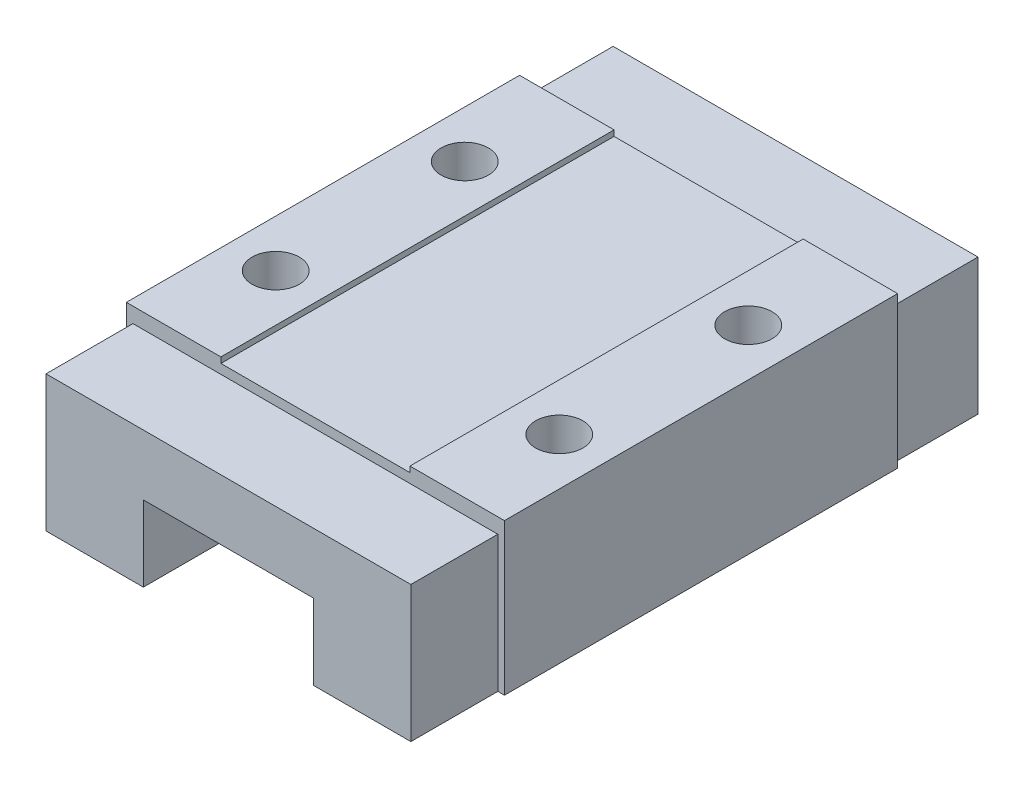
ISO-10303-21;
HEADER;
FILE_DESCRIPTION(('STEP AP214'),'2;1');
FILE_NAME('part.step','',(''),(''),'','','');
FILE_SCHEMA(('AUTOMOTIVE_DESIGN { 1 0 10303 214 1 1 1 1 }'));
ENDSEC;
DATA;
#1=APPLICATION_CONTEXT('core data for automotive mechanical design processes');
#2=APPLICATION_PROTOCOL_DEFINITION('international standard','automotive_design',2000,#1);
#3=PRODUCT_CONTEXT('',#1,'mechanical');
#4=PRODUCT('Part','Part','',(#3));
#5=PRODUCT_RELATED_PRODUCT_CATEGORY('part','',(#4));
#6=PRODUCT_DEFINITION_FORMATION('','',#4);
#7=PRODUCT_DEFINITION_CONTEXT('part definition',#1,'design');
#8=PRODUCT_DEFINITION('design','',#6,#7);
#9=PRODUCT_DEFINITION_SHAPE('','',#8);
#10=(LENGTH_UNIT() NAMED_UNIT(*) SI_UNIT(.MILLI.,.METRE.));
#11=(NAMED_UNIT(*) PLANE_ANGLE_UNIT() SI_UNIT($,.RADIAN.));
#12=(NAMED_UNIT(*) SI_UNIT($,.STERADIAN.) SOLID_ANGLE_UNIT());
#13=UNCERTAINTY_MEASURE_WITH_UNIT(LENGTH_MEASURE(1.E-05),#10,'distance_accuracy_value','');
#14=(GEOMETRIC_REPRESENTATION_CONTEXT(3) GLOBAL_UNCERTAINTY_ASSIGNED_CONTEXT((#13)) GLOBAL_UNIT_ASSIGNED_CONTEXT((#10,
#11,#12)) REPRESENTATION_CONTEXT('',''));
#15=CARTESIAN_POINT('',(0.,0.,0.));
#16=DIRECTION('',(0.,0.,1.));
#17=DIRECTION('',(1.,0.,0.));
#18=AXIS2_PLACEMENT_3D('',#15,#16,#17);
#19=CARTESIAN_POINT('',(0.,0.,10.4));
#20=DIRECTION('',(0.,0.,-1.));
#21=DIRECTION('',(-1.,0.,0.));
#22=AXIS2_PLACEMENT_3D('',#19,#20,#21);
#23=PLANE('',#22);
#24=DIRECTION('',(0.,-1.,0.));
#25=VECTOR('',#24,1.);
#26=CARTESIAN_POINT('',(-9.65,0.,10.4));
#27=LINE('',#26,#25);
#28=CARTESIAN_POINT('',(-9.65,-0.8,10.4));
#29=VERTEX_POINT('',#28);
#30=CARTESIAN_POINT('',(-9.65,-8.,10.4));
#31=VERTEX_POINT('',#30);
#32=EDGE_CURVE('E275',#29,#31,#27,.T.);
#33=ORIENTED_EDGE('',*,*,#32,.F.);
#34=DIRECTION('',(-1.,0.,0.));
#35=VECTOR('',#34,1.);
#36=CARTESIAN_POINT('',(0.,-0.8,10.4));
#37=LINE('',#36,#35);
#38=CARTESIAN_POINT('',(9.65,-0.8,10.4));
#39=VERTEX_POINT('',#38);
#40=EDGE_CURVE('E49',#39,#29,#37,.T.);
#41=ORIENTED_EDGE('',*,*,#40,.F.);
#42=DIRECTION('',(0.,1.,0.));
#43=VECTOR('',#42,1.);
#44=CARTESIAN_POINT('',(9.65,0.,10.4));
#45=LINE('',#44,#43);
#46=CARTESIAN_POINT('',(9.65,-8.,10.4));
#47=VERTEX_POINT('',#46);
#48=EDGE_CURVE('E53',#47,#39,#45,.T.);
#49=ORIENTED_EDGE('',*,*,#48,.F.);
#50=DIRECTION('',(1.,0.,0.));
#51=VECTOR('',#50,1.);
#52=CARTESIAN_POINT('',(10.,-8.,10.4));
#53=LINE('',#52,#51);
#54=CARTESIAN_POINT('',(10.,-8.,10.4));
#55=VERTEX_POINT('',#54);
#56=EDGE_CURVE('E285',#47,#55,#53,.T.);
#57=ORIENTED_EDGE('',*,*,#56,.T.);
#58=DIRECTION('',(0.,1.,0.));
#59=VECTOR('',#58,1.);
#60=CARTESIAN_POINT('',(10.,0.,10.4));
#61=LINE('',#60,#59);
#62=CARTESIAN_POINT('',(10.,0.,10.4));
#63=VERTEX_POINT('',#62);
#64=EDGE_CURVE('E287',#55,#63,#61,.T.);
#65=ORIENTED_EDGE('',*,*,#64,.T.);
#66=DIRECTION('',(-1.,0.,0.));
#67=VECTOR('',#66,1.);
#68=CARTESIAN_POINT('',(5.,0.,10.4));
#69=LINE('',#68,#67);
#70=CARTESIAN_POINT('',(5.,0.,10.4));
#71=VERTEX_POINT('',#70);
#72=EDGE_CURVE('E289',#63,#71,#69,.T.);
#73=ORIENTED_EDGE('',*,*,#72,.T.);
#74=DIRECTION('',(0.,-1.,0.));
#75=VECTOR('',#74,1.);
#76=CARTESIAN_POINT('',(5.,-0.3,10.4));
#77=LINE('',#76,#75);
#78=CARTESIAN_POINT('',(5.,-0.3,10.4));
#79=VERTEX_POINT('',#78);
#80=EDGE_CURVE('E291',#71,#79,#77,.T.);
#81=ORIENTED_EDGE('',*,*,#80,.T.);
#82=DIRECTION('',(-1.,0.,0.));
#83=VECTOR('',#82,1.);
#84=CARTESIAN_POINT('',(-5.,-0.3,10.4));
#85=LINE('',#84,#83);
#86=CARTESIAN_POINT('',(-5.,-0.3,10.4));
#87=VERTEX_POINT('',#86);
#88=EDGE_CURVE('E293',#79,#87,#85,.T.);
#89=ORIENTED_EDGE('',*,*,#88,.T.);
#90=DIRECTION('',(0.,1.,0.));
#91=VECTOR('',#90,1.);
#92=CARTESIAN_POINT('',(-5.,0.,10.4));
#93=LINE('',#92,#91);
#94=CARTESIAN_POINT('',(-5.,0.,10.4));
#95=VERTEX_POINT('',#94);
#96=EDGE_CURVE('E295',#87,#95,#93,.T.);
#97=ORIENTED_EDGE('',*,*,#96,.T.);
#98=DIRECTION('',(-1.,0.,0.));
#99=VECTOR('',#98,1.);
#100=CARTESIAN_POINT('',(-10.,0.,10.4));
#101=LINE('',#100,#99);
#102=CARTESIAN_POINT('',(-10.,0.,10.4));
#103=VERTEX_POINT('',#102);
#104=EDGE_CURVE('E297',#95,#103,#101,.T.);
#105=ORIENTED_EDGE('',*,*,#104,.T.);
#106=DIRECTION('',(0.,-1.,0.));
#107=VECTOR('',#106,1.);
#108=CARTESIAN_POINT('',(-10.,-8.,10.4));
#109=LINE('',#108,#107);
#110=CARTESIAN_POINT('',(-10.,-8.,10.4));
#111=VERTEX_POINT('',#110);
#112=EDGE_CURVE('E279',#103,#111,#109,.T.);
#113=ORIENTED_EDGE('',*,*,#112,.T.);
#114=DIRECTION('',(1.,0.,0.));
#115=VECTOR('',#114,1.);
#116=CARTESIAN_POINT('',(-4.5,-8.,10.4));
#117=LINE('',#116,#115);
#118=EDGE_CURVE('E282',#111,#31,#117,.T.);
#119=ORIENTED_EDGE('',*,*,#118,.T.);
#120=EDGE_LOOP('',(#33,#41,#49,#57,#65,#73,#81,#89,#97,#105,#113,#119));
#121=FACE_BOUND('',#120,.T.);
#122=ADVANCED_FACE('F34',(#121),#23,.F.);
#123=CARTESIAN_POINT('',(0.,0.,-10.4));
#124=DIRECTION('',(0.,0.,-1.));
#125=DIRECTION('',(-1.,0.,0.));
#126=AXIS2_PLACEMENT_3D('',#123,#124,#125);
#127=PLANE('',#126);
#128=DIRECTION('',(-1.,0.,0.));
#129=VECTOR('',#128,1.);
#130=CARTESIAN_POINT('',(0.,-0.8,-10.4));
#131=LINE('',#130,#129);
#132=CARTESIAN_POINT('',(9.65,-0.8,-10.4));
#133=VERTEX_POINT('',#132);
#134=CARTESIAN_POINT('',(-9.65,-0.8,-10.4));
#135=VERTEX_POINT('',#134);
#136=EDGE_CURVE('E349',#133,#135,#131,.T.);
#137=ORIENTED_EDGE('',*,*,#136,.T.);
#138=DIRECTION('',(0.,-1.,0.));
#139=VECTOR('',#138,1.);
#140=CARTESIAN_POINT('',(-9.65,0.,-10.4));
#141=LINE('',#140,#139);
#142=CARTESIAN_POINT('',(-9.65,-8.,-10.4));
#143=VERTEX_POINT('',#142);
#144=EDGE_CURVE('E11',#135,#143,#141,.T.);
#145=ORIENTED_EDGE('',*,*,#144,.T.);
#146=DIRECTION('',(1.,0.,0.));
#147=VECTOR('',#146,1.);
#148=CARTESIAN_POINT('',(-4.5,-8.,-10.4));
#149=LINE('',#148,#147);
#150=CARTESIAN_POINT('',(-10.,-8.,-10.4));
#151=VERTEX_POINT('',#150);
#152=EDGE_CURVE('E302',#151,#143,#149,.T.);
#153=ORIENTED_EDGE('',*,*,#152,.F.);
#154=DIRECTION('',(0.,-1.,0.));
#155=VECTOR('',#154,1.);
#156=CARTESIAN_POINT('',(-10.,-8.,-10.4));
#157=LINE('',#156,#155);
#158=CARTESIAN_POINT('',(-10.,0.,-10.4));
#159=VERTEX_POINT('',#158);
#160=EDGE_CURVE('E278',#159,#151,#157,.T.);
#161=ORIENTED_EDGE('',*,*,#160,.F.);
#162=DIRECTION('',(-1.,0.,0.));
#163=VECTOR('',#162,1.);
#164=CARTESIAN_POINT('',(-10.,0.,-10.4));
#165=LINE('',#164,#163);
#166=CARTESIAN_POINT('',(-5.,0.,-10.4));
#167=VERTEX_POINT('',#166);
#168=EDGE_CURVE('E283',#167,#159,#165,.T.);
#169=ORIENTED_EDGE('',*,*,#168,.F.);
#170=DIRECTION('',(0.,1.,0.));
#171=VECTOR('',#170,1.);
#172=CARTESIAN_POINT('',(-5.,0.,-10.4));
#173=LINE('',#172,#171);
#174=CARTESIAN_POINT('',(-5.,-0.3,-10.4));
#175=VERTEX_POINT('',#174);
#176=EDGE_CURVE('E315',#175,#167,#173,.T.);
#177=ORIENTED_EDGE('',*,*,#176,.F.);
#178=DIRECTION('',(-1.,0.,0.));
#179=VECTOR('',#178,1.);
#180=CARTESIAN_POINT('',(-5.,-0.3,-10.4));
#181=LINE('',#180,#179);
#182=CARTESIAN_POINT('',(5.,-0.3,-10.4));
#183=VERTEX_POINT('',#182);
#184=EDGE_CURVE('E313',#183,#175,#181,.T.);
#185=ORIENTED_EDGE('',*,*,#184,.F.);
#186=DIRECTION('',(0.,-1.,0.));
#187=VECTOR('',#186,1.);
#188=CARTESIAN_POINT('',(5.,-0.3,-10.4));
#189=LINE('',#188,#187);
#190=CARTESIAN_POINT('',(5.,0.,-10.4));
#191=VERTEX_POINT('',#190);
#192=EDGE_CURVE('E311',#191,#183,#189,.T.);
#193=ORIENTED_EDGE('',*,*,#192,.F.);
#194=DIRECTION('',(-1.,0.,0.));
#195=VECTOR('',#194,1.);
#196=CARTESIAN_POINT('',(5.,0.,-10.4));
#197=LINE('',#196,#195);
#198=CARTESIAN_POINT('',(10.,0.,-10.4));
#199=VERTEX_POINT('',#198);
#200=EDGE_CURVE('E309',#199,#191,#197,.T.);
#201=ORIENTED_EDGE('',*,*,#200,.F.);
#202=DIRECTION('',(0.,1.,0.));
#203=VECTOR('',#202,1.);
#204=CARTESIAN_POINT('',(10.,0.,-10.4));
#205=LINE('',#204,#203);
#206=CARTESIAN_POINT('',(10.,-8.,-10.4));
#207=VERTEX_POINT('',#206);
#208=EDGE_CURVE('E307',#207,#199,#205,.T.);
#209=ORIENTED_EDGE('',*,*,#208,.F.);
#210=DIRECTION('',(1.,0.,0.));
#211=VECTOR('',#210,1.);
#212=CARTESIAN_POINT('',(10.,-8.,-10.4));
#213=LINE('',#212,#211);
#214=CARTESIAN_POINT('',(9.65,-8.,-10.4));
#215=VERTEX_POINT('',#214);
#216=EDGE_CURVE('E305',#215,#207,#213,.T.);
#217=ORIENTED_EDGE('',*,*,#216,.F.);
#218=DIRECTION('',(0.,1.,0.));
#219=VECTOR('',#218,1.);
#220=CARTESIAN_POINT('',(9.65,0.,-10.4));
#221=LINE('',#220,#219);
#222=EDGE_CURVE('E42',#215,#133,#221,.T.);
#223=ORIENTED_EDGE('',*,*,#222,.T.);
#224=EDGE_LOOP('',(#137,#145,#153,#161,#169,#177,#185,#193,#201,#209,#217,#223));
#225=FACE_BOUND('',#224,.T.);
#226=ADVANCED_FACE('F354',(#225),#127,.T.);
#227=CARTESIAN_POINT('',(-10.,-8.,10.4));
#228=DIRECTION('',(1.,0.,0.));
#229=DIRECTION('',(0.,1.,0.));
#230=AXIS2_PLACEMENT_3D('',#227,#228,#229);
#231=PLANE('',#230);
#232=ORIENTED_EDGE('',*,*,#160,.T.);
#233=DIRECTION('',(0.,0.,-1.));
#234=VECTOR('',#233,1.);
#235=CARTESIAN_POINT('',(-10.,-8.,10.4));
#236=LINE('',#235,#234);
#237=EDGE_CURVE('E346',#111,#151,#236,.T.);
#238=ORIENTED_EDGE('',*,*,#237,.F.);
#239=ORIENTED_EDGE('',*,*,#112,.F.);
#240=DIRECTION('',(0.,0.,-1.));
#241=VECTOR('',#240,1.);
#242=CARTESIAN_POINT('',(-10.,0.,10.4));
#243=LINE('',#242,#241);
#244=EDGE_CURVE('E299',#103,#159,#243,.T.);
#245=ORIENTED_EDGE('',*,*,#244,.T.);
#246=EDGE_LOOP('',(#232,#238,#239,#245));
#247=FACE_BOUND('',#246,.T.);
#248=ADVANCED_FACE('F36',(#247),#231,.F.);
#249=CARTESIAN_POINT('',(-4.5,-8.,10.4));
#250=DIRECTION('',(0.,1.,0.));
#251=DIRECTION('',(-1.,0.,0.));
#252=AXIS2_PLACEMENT_3D('',#249,#250,#251);
#253=PLANE('',#252);
#254=DIRECTION('',(0.,0.,-1.));
#255=VECTOR('',#254,1.);
#256=CARTESIAN_POINT('',(-4.5,-8.,10.4));
#257=LINE('',#256,#255);
#258=CARTESIAN_POINT('',(-4.5,-8.,15.));
#259=VERTEX_POINT('',#258);
#260=CARTESIAN_POINT('',(-4.5,-8.,-15.));
#261=VERTEX_POINT('',#260);
#262=EDGE_CURVE('E344',#259,#261,#257,.T.);
#263=ORIENTED_EDGE('',*,*,#262,.F.);
#264=DIRECTION('',(1.,0.,0.));
#265=VECTOR('',#264,1.);
#266=CARTESIAN_POINT('',(-4.5,-8.,15.));
#267=LINE('',#266,#265);
#268=CARTESIAN_POINT('',(-9.65,-8.,15.));
#269=VERTEX_POINT('',#268);
#270=EDGE_CURVE('E216',#269,#259,#267,.T.);
#271=ORIENTED_EDGE('',*,*,#270,.F.);
#272=DIRECTION('',(0.,0.,-1.));
#273=VECTOR('',#272,1.);
#274=CARTESIAN_POINT('',(-9.65,-8.,15.));
#275=LINE('',#274,#273);
#276=EDGE_CURVE('E270',#269,#31,#275,.T.);
#277=ORIENTED_EDGE('',*,*,#276,.T.);
#278=ORIENTED_EDGE('',*,*,#118,.F.);
#279=ORIENTED_EDGE('',*,*,#237,.T.);
#280=ORIENTED_EDGE('',*,*,#152,.T.);
#281=CARTESIAN_POINT('',(-9.65,-8.,-15.));
#282=VERTEX_POINT('',#281);
#283=EDGE_CURVE('E269',#143,#282,#275,.T.);
#284=ORIENTED_EDGE('',*,*,#283,.T.);
#285=DIRECTION('',(1.,0.,0.));
#286=VECTOR('',#285,1.);
#287=CARTESIAN_POINT('',(-4.5,-8.,-15.));
#288=LINE('',#287,#286);
#289=EDGE_CURVE('E238',#282,#261,#288,.T.);
#290=ORIENTED_EDGE('',*,*,#289,.T.);
#291=EDGE_LOOP('',(#263,#271,#277,#278,#279,#280,#284,#290));
#292=FACE_BOUND('',#291,.T.);
#293=ADVANCED_FACE('F379',(#292),#253,.F.);
#294=CARTESIAN_POINT('',(-4.5,-4.,10.4));
#295=DIRECTION('',(-1.,0.,0.));
#296=DIRECTION('',(0.,0.,1.));
#297=AXIS2_PLACEMENT_3D('',#294,#295,#296);
#298=PLANE('',#297);
#299=ORIENTED_EDGE('',*,*,#262,.T.);
#300=DIRECTION('',(0.,1.,0.));
#301=VECTOR('',#300,1.);
#302=CARTESIAN_POINT('',(-4.5,-4.,-15.));
#303=LINE('',#302,#301);
#304=CARTESIAN_POINT('',(-4.5,-4.,-15.));
#305=VERTEX_POINT('',#304);
#306=EDGE_CURVE('E241',#261,#305,#303,.T.);
#307=ORIENTED_EDGE('',*,*,#306,.T.);
#308=DIRECTION('',(0.,0.,-1.));
#309=VECTOR('',#308,1.);
#310=CARTESIAN_POINT('',(-4.5,-4.,10.4));
#311=LINE('',#310,#309);
#312=CARTESIAN_POINT('',(-4.5,-4.,15.));
#313=VERTEX_POINT('',#312);
#314=EDGE_CURVE('E342',#313,#305,#311,.T.);
#315=ORIENTED_EDGE('',*,*,#314,.F.);
#316=DIRECTION('',(0.,1.,0.));
#317=VECTOR('',#316,1.);
#318=CARTESIAN_POINT('',(-4.5,-4.,15.));
#319=LINE('',#318,#317);
#320=EDGE_CURVE('E220',#259,#313,#319,.T.);
#321=ORIENTED_EDGE('',*,*,#320,.F.);
#322=EDGE_LOOP('',(#299,#307,#315,#321));
#323=FACE_BOUND('',#322,.T.);
#324=ADVANCED_FACE('F431',(#323),#298,.F.);
#325=CARTESIAN_POINT('',(4.5,-4.,10.4));
#326=DIRECTION('',(0.,1.,0.));
#327=DIRECTION('',(-1.,0.,0.));
#328=AXIS2_PLACEMENT_3D('',#325,#326,#327);
#329=PLANE('',#328);
#330=ORIENTED_EDGE('',*,*,#314,.T.);
#331=DIRECTION('',(1.,0.,0.));
#332=VECTOR('',#331,1.);
#333=CARTESIAN_POINT('',(4.5,-4.,-15.));
#334=LINE('',#333,#332);
#335=CARTESIAN_POINT('',(4.5,-4.,-15.));
#336=VERTEX_POINT('',#335);
#337=EDGE_CURVE('E244',#305,#336,#334,.T.);
#338=ORIENTED_EDGE('',*,*,#337,.T.);
#339=DIRECTION('',(0.,0.,-1.));
#340=VECTOR('',#339,1.);
#341=CARTESIAN_POINT('',(4.5,-4.,10.4));
#342=LINE('',#341,#340);
#343=CARTESIAN_POINT('',(4.5,-4.,15.));
#344=VERTEX_POINT('',#343);
#345=EDGE_CURVE('E340',#344,#336,#342,.T.);
#346=ORIENTED_EDGE('',*,*,#345,.F.);
#347=DIRECTION('',(1.,0.,0.));
#348=VECTOR('',#347,1.);
#349=CARTESIAN_POINT('',(4.5,-4.,15.));
#350=LINE('',#349,#348);
#351=EDGE_CURVE('E223',#313,#344,#350,.T.);
#352=ORIENTED_EDGE('',*,*,#351,.F.);
#353=EDGE_LOOP('',(#330,#338,#346,#352));
#354=FACE_BOUND('',#353,.T.);
#355=ADVANCED_FACE('F428',(#354),#329,.F.);
#356=CARTESIAN_POINT('',(4.5,-8.,10.4));
#357=DIRECTION('',(1.,0.,0.));
#358=DIRECTION('',(0.,0.,-1.));
#359=AXIS2_PLACEMENT_3D('',#356,#357,#358);
#360=PLANE('',#359);
#361=ORIENTED_EDGE('',*,*,#345,.T.);
#362=DIRECTION('',(0.,-1.,0.));
#363=VECTOR('',#362,1.);
#364=CARTESIAN_POINT('',(4.5,-8.,-15.));
#365=LINE('',#364,#363);
#366=CARTESIAN_POINT('',(4.5,-8.,-15.));
#367=VERTEX_POINT('',#366);
#368=EDGE_CURVE('E247',#336,#367,#365,.T.);
#369=ORIENTED_EDGE('',*,*,#368,.T.);
#370=DIRECTION('',(0.,0.,-1.));
#371=VECTOR('',#370,1.);
#372=CARTESIAN_POINT('',(4.5,-8.,10.4));
#373=LINE('',#372,#371);
#374=CARTESIAN_POINT('',(4.5,-8.,15.));
#375=VERTEX_POINT('',#374);
#376=EDGE_CURVE('E338',#375,#367,#373,.T.);
#377=ORIENTED_EDGE('',*,*,#376,.F.);
#378=DIRECTION('',(0.,-1.,0.));
#379=VECTOR('',#378,1.);
#380=CARTESIAN_POINT('',(4.5,-8.,15.));
#381=LINE('',#380,#379);
#382=EDGE_CURVE('E226',#344,#375,#381,.T.);
#383=ORIENTED_EDGE('',*,*,#382,.F.);
#384=EDGE_LOOP('',(#361,#369,#377,#383));
#385=FACE_BOUND('',#384,.T.);
#386=ADVANCED_FACE('F424',(#385),#360,.F.);
#387=CARTESIAN_POINT('',(10.,-8.,10.4));
#388=DIRECTION('',(0.,1.,0.));
#389=DIRECTION('',(-1.,0.,0.));
#390=AXIS2_PLACEMENT_3D('',#387,#388,#389);
#391=PLANE('',#390);
#392=ORIENTED_EDGE('',*,*,#376,.T.);
#393=DIRECTION('',(1.,0.,0.));
#394=VECTOR('',#393,1.);
#395=CARTESIAN_POINT('',(9.65,-8.,-15.));
#396=LINE('',#395,#394);
#397=CARTESIAN_POINT('',(9.65,-8.,-15.));
#398=VERTEX_POINT('',#397);
#399=EDGE_CURVE('E250',#367,#398,#396,.T.);
#400=ORIENTED_EDGE('',*,*,#399,.T.);
#401=DIRECTION('',(0.,0.,-1.));
#402=VECTOR('',#401,1.);
#403=CARTESIAN_POINT('',(9.65,-8.,15.));
#404=LINE('',#403,#402);
#405=EDGE_CURVE('E265',#215,#398,#404,.T.);
#406=ORIENTED_EDGE('',*,*,#405,.F.);
#407=ORIENTED_EDGE('',*,*,#216,.T.);
#408=DIRECTION('',(0.,0.,-1.));
#409=VECTOR('',#408,1.);
#410=CARTESIAN_POINT('',(10.,-8.,10.4));
#411=LINE('',#410,#409);
#412=EDGE_CURVE('E335',#55,#207,#411,.T.);
#413=ORIENTED_EDGE('',*,*,#412,.F.);
#414=ORIENTED_EDGE('',*,*,#56,.F.);
#415=CARTESIAN_POINT('',(9.65,-8.,15.));
#416=VERTEX_POINT('',#415);
#417=EDGE_CURVE('E266',#416,#47,#404,.T.);
#418=ORIENTED_EDGE('',*,*,#417,.F.);
#419=DIRECTION('',(1.,0.,0.));
#420=VECTOR('',#419,1.);
#421=CARTESIAN_POINT('',(9.65,-8.,15.));
#422=LINE('',#421,#420);
#423=EDGE_CURVE('E229',#375,#416,#422,.T.);
#424=ORIENTED_EDGE('',*,*,#423,.F.);
#425=EDGE_LOOP('',(#392,#400,#406,#407,#413,#414,#418,#424));
#426=FACE_BOUND('',#425,.T.);
#427=ADVANCED_FACE('F361',(#426),#391,.F.);
#428=CARTESIAN_POINT('',(10.,0.,10.4));
#429=DIRECTION('',(-1.,0.,0.));
#430=DIRECTION('',(0.,-1.,0.));
#431=AXIS2_PLACEMENT_3D('',#428,#429,#430);
#432=PLANE('',#431);
#433=ORIENTED_EDGE('',*,*,#208,.T.);
#434=DIRECTION('',(0.,0.,-1.));
#435=VECTOR('',#434,1.);
#436=CARTESIAN_POINT('',(10.,0.,10.4));
#437=LINE('',#436,#435);
#438=EDGE_CURVE('E332',#63,#199,#437,.T.);
#439=ORIENTED_EDGE('',*,*,#438,.F.);
#440=ORIENTED_EDGE('',*,*,#64,.F.);
#441=ORIENTED_EDGE('',*,*,#412,.T.);
#442=EDGE_LOOP('',(#433,#439,#440,#441));
#443=FACE_BOUND('',#442,.T.);
#444=ADVANCED_FACE('F411',(#443),#432,.F.);
#445=CARTESIAN_POINT('',(5.,0.,10.4));
#446=DIRECTION('',(0.,-1.,0.));
#447=DIRECTION('',(0.,0.,-1.));
#448=AXIS2_PLACEMENT_3D('',#445,#446,#447);
#449=PLANE('',#448);
#450=CARTESIAN_POINT('',(7.5,0.,-5.));
#451=DIRECTION('',(0.,1.,0.));
#452=DIRECTION('',(0.,0.,1.));
#453=AXIS2_PLACEMENT_3D('',#450,#451,#452);
#454=CIRCLE('',#453,1.25);
#455=CARTESIAN_POINT('',(7.5,0.,-3.75));
#456=VERTEX_POINT('',#455);
#457=EDGE_CURVE('E190',#456,#456,#454,.T.);
#458=ORIENTED_EDGE('',*,*,#457,.F.);
#459=EDGE_LOOP('',(#458));
#460=FACE_BOUND('',#459,.T.);
#461=CARTESIAN_POINT('',(7.5,0.,5.));
#462=DIRECTION('',(0.,1.,0.));
#463=DIRECTION('',(0.,0.,1.));
#464=AXIS2_PLACEMENT_3D('',#461,#462,#463);
#465=CIRCLE('',#464,1.25);
#466=CARTESIAN_POINT('',(7.5,0.,6.25));
#467=VERTEX_POINT('',#466);
#468=EDGE_CURVE('E189',#467,#467,#465,.T.);
#469=ORIENTED_EDGE('',*,*,#468,.F.);
#470=EDGE_LOOP('',(#469));
#471=FACE_BOUND('',#470,.T.);
#472=ORIENTED_EDGE('',*,*,#200,.T.);
#473=DIRECTION('',(0.,0.,-1.));
#474=VECTOR('',#473,1.);
#475=CARTESIAN_POINT('',(5.,0.,10.4));
#476=LINE('',#475,#474);
#477=EDGE_CURVE('E329',#71,#191,#476,.T.);
#478=ORIENTED_EDGE('',*,*,#477,.F.);
#479=ORIENTED_EDGE('',*,*,#72,.F.);
#480=ORIENTED_EDGE('',*,*,#438,.T.);
#481=EDGE_LOOP('',(#472,#478,#479,#480));
#482=FACE_BOUND('',#481,.T.);
#483=ADVANCED_FACE('F407',(#460,#471,#482),#449,.F.);
#484=CARTESIAN_POINT('',(5.,-0.3,10.4));
#485=DIRECTION('',(1.,0.,0.));
#486=DIRECTION('',(0.,0.,-1.));
#487=AXIS2_PLACEMENT_3D('',#484,#485,#486);
#488=PLANE('',#487);
#489=ORIENTED_EDGE('',*,*,#192,.T.);
#490=DIRECTION('',(0.,0.,-1.));
#491=VECTOR('',#490,1.);
#492=CARTESIAN_POINT('',(5.,-0.3,10.4));
#493=LINE('',#492,#491);
#494=EDGE_CURVE('E326',#79,#183,#493,.T.);
#495=ORIENTED_EDGE('',*,*,#494,.F.);
#496=ORIENTED_EDGE('',*,*,#80,.F.);
#497=ORIENTED_EDGE('',*,*,#477,.T.);
#498=EDGE_LOOP('',(#489,#495,#496,#497));
#499=FACE_BOUND('',#498,.T.);
#500=ADVANCED_FACE('F402',(#499),#488,.F.);
#501=CARTESIAN_POINT('',(-5.,-0.3,10.4));
#502=DIRECTION('',(0.,-1.,0.));
#503=DIRECTION('',(0.,0.,-1.));
#504=AXIS2_PLACEMENT_3D('',#501,#502,#503);
#505=PLANE('',#504);
#506=ORIENTED_EDGE('',*,*,#184,.T.);
#507=DIRECTION('',(0.,0.,-1.));
#508=VECTOR('',#507,1.);
#509=CARTESIAN_POINT('',(-5.,-0.3,10.4));
#510=LINE('',#509,#508);
#511=EDGE_CURVE('E323',#87,#175,#510,.T.);
#512=ORIENTED_EDGE('',*,*,#511,.F.);
#513=ORIENTED_EDGE('',*,*,#88,.F.);
#514=ORIENTED_EDGE('',*,*,#494,.T.);
#515=EDGE_LOOP('',(#506,#512,#513,#514));
#516=FACE_BOUND('',#515,.T.);
#517=ADVANCED_FACE('F397',(#516),#505,.F.);
#518=CARTESIAN_POINT('',(-5.,0.,10.4));
#519=DIRECTION('',(-1.,0.,0.));
#520=DIRECTION('',(0.,0.,1.));
#521=AXIS2_PLACEMENT_3D('',#518,#519,#520);
#522=PLANE('',#521);
#523=ORIENTED_EDGE('',*,*,#176,.T.);
#524=DIRECTION('',(0.,0.,-1.));
#525=VECTOR('',#524,1.);
#526=CARTESIAN_POINT('',(-5.,0.,10.4));
#527=LINE('',#526,#525);
#528=EDGE_CURVE('E320',#95,#167,#527,.T.);
#529=ORIENTED_EDGE('',*,*,#528,.F.);
#530=ORIENTED_EDGE('',*,*,#96,.F.);
#531=ORIENTED_EDGE('',*,*,#511,.T.);
#532=EDGE_LOOP('',(#523,#529,#530,#531));
#533=FACE_BOUND('',#532,.T.);
#534=ADVANCED_FACE('F393',(#533),#522,.F.);
#535=CARTESIAN_POINT('',(-10.,0.,10.4));
#536=DIRECTION('',(0.,-1.,0.));
#537=DIRECTION('',(0.,0.,-1.));
#538=AXIS2_PLACEMENT_3D('',#535,#536,#537);
#539=PLANE('',#538);
#540=CARTESIAN_POINT('',(-7.5,0.,-5.));
#541=DIRECTION('',(0.,1.,0.));
#542=DIRECTION('',(0.,0.,1.));
#543=AXIS2_PLACEMENT_3D('',#540,#541,#542);
#544=CIRCLE('',#543,1.25);
#545=CARTESIAN_POINT('',(-7.5,0.,-3.75));
#546=VERTEX_POINT('',#545);
#547=EDGE_CURVE('E200',#546,#546,#544,.T.);
#548=ORIENTED_EDGE('',*,*,#547,.F.);
#549=EDGE_LOOP('',(#548));
#550=FACE_BOUND('',#549,.T.);
#551=CARTESIAN_POINT('',(-7.5,0.,5.));
#552=DIRECTION('',(0.,1.,0.));
#553=DIRECTION('',(0.,0.,1.));
#554=AXIS2_PLACEMENT_3D('',#551,#552,#553);
#555=CIRCLE('',#554,1.25);
#556=CARTESIAN_POINT('',(-7.5,0.,6.25));
#557=VERTEX_POINT('',#556);
#558=EDGE_CURVE('E206',#557,#557,#555,.T.);
#559=ORIENTED_EDGE('',*,*,#558,.F.);
#560=EDGE_LOOP('',(#559));
#561=FACE_BOUND('',#560,.T.);
#562=ORIENTED_EDGE('',*,*,#168,.T.);
#563=ORIENTED_EDGE('',*,*,#244,.F.);
#564=ORIENTED_EDGE('',*,*,#104,.F.);
#565=ORIENTED_EDGE('',*,*,#528,.T.);
#566=EDGE_LOOP('',(#562,#563,#564,#565));
#567=FACE_BOUND('',#566,.T.);
#568=ADVANCED_FACE('F388',(#550,#561,#567),#539,.F.);
#569=CARTESIAN_POINT('',(0.,0.,-15.));
#570=DIRECTION('',(0.,0.,-1.));
#571=DIRECTION('',(-1.,0.,0.));
#572=AXIS2_PLACEMENT_3D('',#569,#570,#571);
#573=PLANE('',#572);
#574=DIRECTION('',(0.,-1.,0.));
#575=VECTOR('',#574,1.);
#576=CARTESIAN_POINT('',(-9.65,-8.,-15.));
#577=LINE('',#576,#575);
#578=CARTESIAN_POINT('',(-9.65,-0.8,-15.));
#579=VERTEX_POINT('',#578);
#580=EDGE_CURVE('E212',#579,#282,#577,.T.);
#581=ORIENTED_EDGE('',*,*,#580,.F.);
#582=DIRECTION('',(-1.,0.,0.));
#583=VECTOR('',#582,1.);
#584=CARTESIAN_POINT('',(-9.65,-0.8,-15.));
#585=LINE('',#584,#583);
#586=CARTESIAN_POINT('',(9.65,-0.8,-15.));
#587=VERTEX_POINT('',#586);
#588=EDGE_CURVE('E217',#587,#579,#585,.T.);
#589=ORIENTED_EDGE('',*,*,#588,.F.);
#590=DIRECTION('',(0.,1.,0.));
#591=VECTOR('',#590,1.);
#592=CARTESIAN_POINT('',(9.65,-0.8,-15.));
#593=LINE('',#592,#591);
#594=EDGE_CURVE('E253',#398,#587,#593,.T.);
#595=ORIENTED_EDGE('',*,*,#594,.F.);
#596=ORIENTED_EDGE('',*,*,#399,.F.);
#597=ORIENTED_EDGE('',*,*,#368,.F.);
#598=ORIENTED_EDGE('',*,*,#337,.F.);
#599=ORIENTED_EDGE('',*,*,#306,.F.);
#600=ORIENTED_EDGE('',*,*,#289,.F.);
#601=EDGE_LOOP('',(#581,#589,#595,#596,#597,#598,#599,#600));
#602=FACE_BOUND('',#601,.T.);
#603=ADVANCED_FACE('F370',(#602),#573,.T.);
#604=CARTESIAN_POINT('',(-9.65,-0.8,15.));
#605=DIRECTION('',(0.,-1.,0.));
#606=DIRECTION('',(1.,0.,0.));
#607=AXIS2_PLACEMENT_3D('',#604,#605,#606);
#608=PLANE('',#607);
#609=ORIENTED_EDGE('',*,*,#136,.F.);
#610=DIRECTION('',(0.,0.,-1.));
#611=VECTOR('',#610,1.);
#612=CARTESIAN_POINT('',(9.65,-0.8,15.));
#613=LINE('',#612,#611);
#614=EDGE_CURVE('E261',#133,#587,#613,.T.);
#615=ORIENTED_EDGE('',*,*,#614,.T.);
#616=ORIENTED_EDGE('',*,*,#588,.T.);
#617=DIRECTION('',(0.,0.,-1.));
#618=VECTOR('',#617,1.);
#619=CARTESIAN_POINT('',(-9.65,-0.8,15.));
#620=LINE('',#619,#618);
#621=EDGE_CURVE('E235',#135,#579,#620,.T.);
#622=ORIENTED_EDGE('',*,*,#621,.F.);
#623=EDGE_LOOP('',(#609,#615,#616,#622));
#624=FACE_BOUND('',#623,.T.);
#625=ADVANCED_FACE('F373',(#624),#608,.F.);
#626=CARTESIAN_POINT('',(9.65,-0.8,15.));
#627=DIRECTION('',(-1.,0.,0.));
#628=DIRECTION('',(0.,0.,1.));
#629=AXIS2_PLACEMENT_3D('',#626,#627,#628);
#630=PLANE('',#629);
#631=ORIENTED_EDGE('',*,*,#222,.F.);
#632=ORIENTED_EDGE('',*,*,#405,.T.);
#633=ORIENTED_EDGE('',*,*,#594,.T.);
#634=ORIENTED_EDGE('',*,*,#614,.F.);
#635=EDGE_LOOP('',(#631,#632,#633,#634));
#636=FACE_BOUND('',#635,.T.);
#637=ADVANCED_FACE('F359',(#636),#630,.F.);
#638=CARTESIAN_POINT('',(-9.65,-8.,15.));
#639=DIRECTION('',(1.,0.,0.));
#640=DIRECTION('',(0.,0.,-1.));
#641=AXIS2_PLACEMENT_3D('',#638,#639,#640);
#642=PLANE('',#641);
#643=ORIENTED_EDGE('',*,*,#144,.F.);
#644=ORIENTED_EDGE('',*,*,#621,.T.);
#645=ORIENTED_EDGE('',*,*,#580,.T.);
#646=ORIENTED_EDGE('',*,*,#283,.F.);
#647=EDGE_LOOP('',(#643,#644,#645,#646));
#648=FACE_BOUND('',#647,.T.);
#649=ADVANCED_FACE('F376',(#648),#642,.F.);
#650=CARTESIAN_POINT('',(-9.65,-0.8,15.));
#651=VERTEX_POINT('',#650);
#652=EDGE_CURVE('E258',#651,#29,#620,.T.);
#653=ORIENTED_EDGE('',*,*,#652,.T.);
#654=ORIENTED_EDGE('',*,*,#32,.T.);
#655=ORIENTED_EDGE('',*,*,#276,.F.);
#656=DIRECTION('',(0.,-1.,0.));
#657=VECTOR('',#656,1.);
#658=CARTESIAN_POINT('',(-9.65,-8.,15.));
#659=LINE('',#658,#657);
#660=EDGE_CURVE('E213',#651,#269,#659,.T.);
#661=ORIENTED_EDGE('',*,*,#660,.F.);
#662=EDGE_LOOP('',(#653,#654,#655,#661));
#663=FACE_BOUND('',#662,.T.);
#664=ADVANCED_FACE('F435',(#663),#642,.F.);
#665=ORIENTED_EDGE('',*,*,#417,.T.);
#666=ORIENTED_EDGE('',*,*,#48,.T.);
#667=CARTESIAN_POINT('',(9.65,-0.8,15.));
#668=VERTEX_POINT('',#667);
#669=EDGE_CURVE('E262',#668,#39,#613,.T.);
#670=ORIENTED_EDGE('',*,*,#669,.F.);
#671=DIRECTION('',(0.,1.,0.));
#672=VECTOR('',#671,1.);
#673=CARTESIAN_POINT('',(9.65,-0.8,15.));
#674=LINE('',#673,#672);
#675=EDGE_CURVE('E231',#416,#668,#674,.T.);
#676=ORIENTED_EDGE('',*,*,#675,.F.);
#677=EDGE_LOOP('',(#665,#666,#670,#676));
#678=FACE_BOUND('',#677,.T.);
#679=ADVANCED_FACE('F415',(#678),#630,.F.);
#680=ORIENTED_EDGE('',*,*,#669,.T.);
#681=ORIENTED_EDGE('',*,*,#40,.T.);
#682=ORIENTED_EDGE('',*,*,#652,.F.);
#683=DIRECTION('',(-1.,0.,0.));
#684=VECTOR('',#683,1.);
#685=CARTESIAN_POINT('',(-9.65,-0.8,15.));
#686=LINE('',#685,#684);
#687=EDGE_CURVE('E233',#668,#651,#686,.T.);
#688=ORIENTED_EDGE('',*,*,#687,.F.);
#689=EDGE_LOOP('',(#680,#681,#682,#688));
#690=FACE_BOUND('',#689,.T.);
#691=ADVANCED_FACE('F437',(#690),#608,.F.);
#692=CARTESIAN_POINT('',(0.,0.,15.));
#693=DIRECTION('',(0.,0.,-1.));
#694=DIRECTION('',(-1.,0.,0.));
#695=AXIS2_PLACEMENT_3D('',#692,#693,#694);
#696=PLANE('',#695);
#697=ORIENTED_EDGE('',*,*,#660,.T.);
#698=ORIENTED_EDGE('',*,*,#270,.T.);
#699=ORIENTED_EDGE('',*,*,#320,.T.);
#700=ORIENTED_EDGE('',*,*,#351,.T.);
#701=ORIENTED_EDGE('',*,*,#382,.T.);
#702=ORIENTED_EDGE('',*,*,#423,.T.);
#703=ORIENTED_EDGE('',*,*,#675,.T.);
#704=ORIENTED_EDGE('',*,*,#687,.T.);
#705=EDGE_LOOP('',(#697,#698,#699,#700,#701,#702,#703,#704));
#706=FACE_BOUND('',#705,.T.);
#707=ADVANCED_FACE('F419',(#706),#696,.F.);
#708=CARTESIAN_POINT('',(-7.5,-3.,5.));
#709=DIRECTION('',(0.,1.,0.));
#710=DIRECTION('',(0.,0.,1.));
#711=AXIS2_PLACEMENT_3D('',#708,#709,#710);
#712=CONICAL_SURFACE('',#711,1.25,1.02974425867665);
#713=CARTESIAN_POINT('',(-7.5,-3.75107577378445,5.));
#714=VERTEX_POINT('',#713);
#715=VERTEX_LOOP('',#714);
#716=FACE_BOUND('',#715,.T.);
#717=CARTESIAN_POINT('',(-7.5,-3.,5.));
#718=DIRECTION('',(0.,1.,0.));
#719=DIRECTION('',(0.,0.,1.));
#720=AXIS2_PLACEMENT_3D('',#717,#718,#719);
#721=CIRCLE('',#720,1.25);
#722=CARTESIAN_POINT('',(-7.5,-3.,6.25));
#723=VERTEX_POINT('',#722);
#724=EDGE_CURVE('E209',#723,#723,#721,.T.);
#725=ORIENTED_EDGE('',*,*,#724,.T.);
#726=EDGE_LOOP('',(#725));
#727=FACE_BOUND('',#726,.T.);
#728=ADVANCED_FACE('F444',(#716,#727),#712,.F.);
#729=CARTESIAN_POINT('',(-7.5,0.,5.));
#730=DIRECTION('',(0.,1.,0.));
#731=DIRECTION('',(0.,0.,1.));
#732=AXIS2_PLACEMENT_3D('',#729,#730,#731);
#733=CYLINDRICAL_SURFACE('',#732,1.25);
#734=ORIENTED_EDGE('',*,*,#724,.F.);
#735=EDGE_LOOP('',(#734));
#736=FACE_BOUND('',#735,.T.);
#737=ORIENTED_EDGE('',*,*,#558,.T.);
#738=EDGE_LOOP('',(#737));
#739=FACE_BOUND('',#738,.T.);
#740=ADVANCED_FACE('F608',(#736,#739),#733,.F.);
#741=CARTESIAN_POINT('',(-7.5,-3.,-5.));
#742=DIRECTION('',(0.,1.,0.));
#743=DIRECTION('',(0.,0.,1.));
#744=AXIS2_PLACEMENT_3D('',#741,#742,#743);
#745=CONICAL_SURFACE('',#744,1.25,1.02974425867665);
#746=CARTESIAN_POINT('',(-7.5,-3.75107577378445,-5.));
#747=VERTEX_POINT('',#746);
#748=VERTEX_LOOP('',#747);
#749=FACE_BOUND('',#748,.T.);
#750=CARTESIAN_POINT('',(-7.5,-3.,-5.));
#751=DIRECTION('',(0.,1.,0.));
#752=DIRECTION('',(0.,0.,1.));
#753=AXIS2_PLACEMENT_3D('',#750,#751,#752);
#754=CIRCLE('',#753,1.25);
#755=CARTESIAN_POINT('',(-7.5,-3.,-3.75));
#756=VERTEX_POINT('',#755);
#757=EDGE_CURVE('E203',#756,#756,#754,.T.);
#758=ORIENTED_EDGE('',*,*,#757,.T.);
#759=EDGE_LOOP('',(#758));
#760=FACE_BOUND('',#759,.T.);
#761=ADVANCED_FACE('F618',(#749,#760),#745,.F.);
#762=CARTESIAN_POINT('',(-7.5,0.,-5.));
#763=DIRECTION('',(0.,1.,0.));
#764=DIRECTION('',(0.,0.,1.));
#765=AXIS2_PLACEMENT_3D('',#762,#763,#764);
#766=CYLINDRICAL_SURFACE('',#765,1.25);
#767=ORIENTED_EDGE('',*,*,#757,.F.);
#768=EDGE_LOOP('',(#767));
#769=FACE_BOUND('',#768,.T.);
#770=ORIENTED_EDGE('',*,*,#547,.T.);
#771=EDGE_LOOP('',(#770));
#772=FACE_BOUND('',#771,.T.);
#773=ADVANCED_FACE('F628',(#769,#772),#766,.F.);
#774=CARTESIAN_POINT('',(7.5,-3.,5.));
#775=DIRECTION('',(0.,1.,0.));
#776=DIRECTION('',(0.,0.,1.));
#777=AXIS2_PLACEMENT_3D('',#774,#775,#776);
#778=CONICAL_SURFACE('',#777,1.25,1.02974425867665);
#779=CARTESIAN_POINT('',(7.5,-3.75107577378445,5.));
#780=VERTEX_POINT('',#779);
#781=VERTEX_LOOP('',#780);
#782=FACE_BOUND('',#781,.T.);
#783=CARTESIAN_POINT('',(7.5,-3.,5.));
#784=DIRECTION('',(0.,1.,0.));
#785=DIRECTION('',(0.,0.,1.));
#786=AXIS2_PLACEMENT_3D('',#783,#784,#785);
#787=CIRCLE('',#786,1.25);
#788=CARTESIAN_POINT('',(7.5,-3.,6.25));
#789=VERTEX_POINT('',#788);
#790=EDGE_CURVE('E193',#789,#789,#787,.T.);
#791=ORIENTED_EDGE('',*,*,#790,.T.);
#792=EDGE_LOOP('',(#791));
#793=FACE_BOUND('',#792,.T.);
#794=ADVANCED_FACE('F638',(#782,#793),#778,.F.);
#795=CARTESIAN_POINT('',(7.5,0.,5.));
#796=DIRECTION('',(0.,1.,0.));
#797=DIRECTION('',(0.,0.,1.));
#798=AXIS2_PLACEMENT_3D('',#795,#796,#797);
#799=CYLINDRICAL_SURFACE('',#798,1.25);
#800=ORIENTED_EDGE('',*,*,#790,.F.);
#801=EDGE_LOOP('',(#800));
#802=FACE_BOUND('',#801,.T.);
#803=ORIENTED_EDGE('',*,*,#468,.T.);
#804=EDGE_LOOP('',(#803));
#805=FACE_BOUND('',#804,.T.);
#806=ADVANCED_FACE('F183',(#802,#805),#799,.F.);
#807=CARTESIAN_POINT('',(7.5,-3.,-5.));
#808=DIRECTION('',(0.,1.,0.));
#809=DIRECTION('',(0.,0.,1.));
#810=AXIS2_PLACEMENT_3D('',#807,#808,#809);
#811=CONICAL_SURFACE('',#810,1.25,1.02974425867665);
#812=CARTESIAN_POINT('',(7.5,-3.75107577378445,-5.));
#813=VERTEX_POINT('',#812);
#814=VERTEX_LOOP('',#813);
#815=FACE_BOUND('',#814,.T.);
#816=CARTESIAN_POINT('',(7.5,-3.,-5.));
#817=DIRECTION('',(0.,1.,0.));
#818=DIRECTION('',(0.,0.,1.));
#819=AXIS2_PLACEMENT_3D('',#816,#817,#818);
#820=CIRCLE('',#819,1.25);
#821=CARTESIAN_POINT('',(7.5,-3.,-3.75));
#822=VERTEX_POINT('',#821);
#823=EDGE_CURVE('E187',#822,#822,#820,.T.);
#824=ORIENTED_EDGE('',*,*,#823,.T.);
#825=EDGE_LOOP('',(#824));
#826=FACE_BOUND('',#825,.T.);
#827=ADVANCED_FACE('F179',(#815,#826),#811,.F.);
#828=CARTESIAN_POINT('',(7.5,0.,-5.));
#829=DIRECTION('',(0.,1.,0.));
#830=DIRECTION('',(0.,0.,1.));
#831=AXIS2_PLACEMENT_3D('',#828,#829,#830);
#832=CYLINDRICAL_SURFACE('',#831,1.25);
#833=ORIENTED_EDGE('',*,*,#823,.F.);
#834=EDGE_LOOP('',(#833));
#835=FACE_BOUND('',#834,.T.);
#836=ORIENTED_EDGE('',*,*,#457,.T.);
#837=EDGE_LOOP('',(#836));
#838=FACE_BOUND('',#837,.T.);
#839=ADVANCED_FACE('F182',(#835,#838),#832,.F.);
#840=CLOSED_SHELL('',(#122,#226,#248,#293,#324,#355,#386,#427,#444,#483,#500,#517,#534,#568,
#603,#625,#637,#649,#664,#679,#691,#707,#728,#740,#761,#773,#794,#806,#827,#839));
#841=MANIFOLD_SOLID_BREP('B2',#840);
#842=ADVANCED_BREP_SHAPE_REPRESENTATION('',(#18,#841),#14);
#843=SHAPE_DEFINITION_REPRESENTATION(#9,#842);
ENDSEC;
END-ISO-10303-21;
